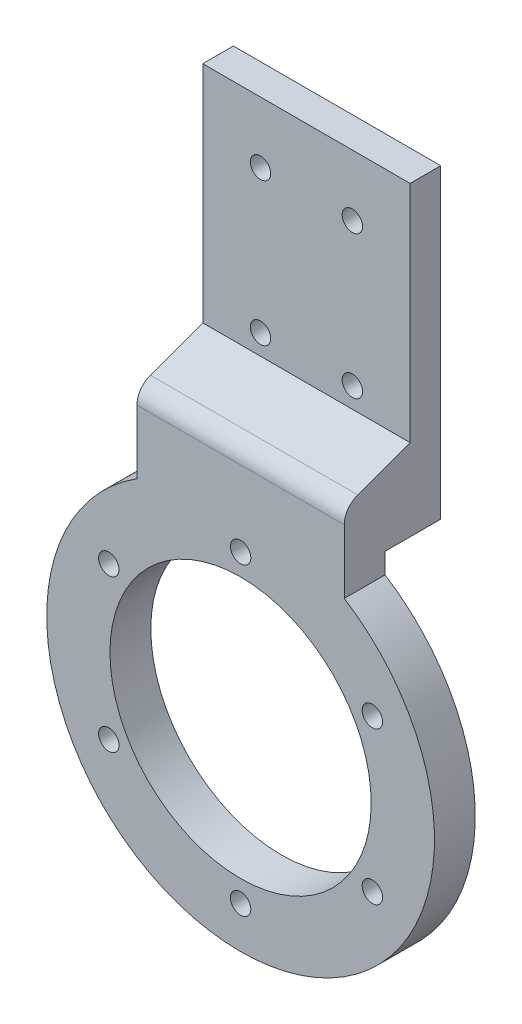
ISO-10303-21;
HEADER;
FILE_DESCRIPTION(('STEP AP214'),'2;1');
FILE_NAME('part.step','',(''),(''),'','','');
FILE_SCHEMA(('AUTOMOTIVE_DESIGN { 1 0 10303 214 1 1 1 1 }'));
ENDSEC;
DATA;
#1=APPLICATION_CONTEXT('core data for automotive mechanical design processes');
#2=APPLICATION_PROTOCOL_DEFINITION('international standard','automotive_design',2000,#1);
#3=PRODUCT_CONTEXT('',#1,'mechanical');
#4=PRODUCT('Part','Part','',(#3));
#5=PRODUCT_RELATED_PRODUCT_CATEGORY('part','',(#4));
#6=PRODUCT_DEFINITION_FORMATION('','',#4);
#7=PRODUCT_DEFINITION_CONTEXT('part definition',#1,'design');
#8=PRODUCT_DEFINITION('design','',#6,#7);
#9=PRODUCT_DEFINITION_SHAPE('','',#8);
#10=(LENGTH_UNIT() NAMED_UNIT(*) SI_UNIT(.MILLI.,.METRE.));
#11=(NAMED_UNIT(*) PLANE_ANGLE_UNIT() SI_UNIT($,.RADIAN.));
#12=(NAMED_UNIT(*) SI_UNIT($,.STERADIAN.) SOLID_ANGLE_UNIT());
#13=UNCERTAINTY_MEASURE_WITH_UNIT(LENGTH_MEASURE(1.E-05),#10,'distance_accuracy_value','');
#14=(GEOMETRIC_REPRESENTATION_CONTEXT(3) GLOBAL_UNCERTAINTY_ASSIGNED_CONTEXT((#13)) GLOBAL_UNIT_ASSIGNED_CONTEXT((#10,
#11,#12)) REPRESENTATION_CONTEXT('',''));
#15=CARTESIAN_POINT('',(0.,0.,0.));
#16=DIRECTION('',(0.,0.,1.));
#17=DIRECTION('',(1.,0.,0.));
#18=AXIS2_PLACEMENT_3D('',#15,#16,#17);
#19=CARTESIAN_POINT('',(-25.4,0.,7.5));
#20=DIRECTION('',(-1.,0.,0.));
#21=DIRECTION('',(0.,0.,1.));
#22=AXIS2_PLACEMENT_3D('',#19,#20,#21);
#23=PLANE('',#22);
#24=DIRECTION('',(0.,-1.,0.));
#25=VECTOR('',#24,1.);
#26=CARTESIAN_POINT('',(-25.4,0.,23.63));
#27=LINE('',#26,#25);
#28=CARTESIAN_POINT('',(-25.4,55.7665080479978,23.63));
#29=VERTEX_POINT('',#28);
#30=CARTESIAN_POINT('',(-25.4,40.13838561776,23.63));
#31=VERTEX_POINT('',#30);
#32=EDGE_CURVE('E247',#29,#31,#27,.T.);
#33=ORIENTED_EDGE('',*,*,#32,.F.);
#34=CARTESIAN_POINT('',(-25.4,55.7665080479978,18.63));
#35=DIRECTION('',(-1.,0.,0.));
#36=DIRECTION('',(0.,0.,1.));
#37=AXIS2_PLACEMENT_3D('',#34,#35,#36);
#38=CIRCLE('',#37,5.);
#39=CARTESIAN_POINT('',(-25.4,60.4649711519274,20.3401007166283));
#40=VERTEX_POINT('',#39);
#41=EDGE_CURVE('E201',#29,#40,#38,.T.);
#42=ORIENTED_EDGE('',*,*,#41,.T.);
#43=DIRECTION('',(0.,-0.342020143325666,0.939692620785909));
#44=VECTOR('',#43,1.);
#45=CARTESIAN_POINT('',(-25.4,65.1383856177602,7.5));
#46=LINE('',#45,#44);
#47=CARTESIAN_POINT('',(-25.4,65.1383856177602,7.5));
#48=VERTEX_POINT('',#47);
#49=EDGE_CURVE('E373',#40,#48,#46,.F.);
#50=ORIENTED_EDGE('',*,*,#49,.T.);
#51=DIRECTION('',(0.,1.,0.));
#52=VECTOR('',#51,1.);
#53=CARTESIAN_POINT('',(-25.4,0.,7.5));
#54=LINE('',#53,#52);
#55=CARTESIAN_POINT('',(-25.4,120.13838565576,7.5));
#56=VERTEX_POINT('',#55);
#57=EDGE_CURVE('E324',#48,#56,#54,.T.);
#58=ORIENTED_EDGE('',*,*,#57,.T.);
#59=DIRECTION('',(0.,0.,-1.));
#60=VECTOR('',#59,1.);
#61=CARTESIAN_POINT('',(-25.4,120.13838565576,7.5));
#62=LINE('',#61,#60);
#63=CARTESIAN_POINT('',(-25.4,120.13838565576,0.));
#64=VERTEX_POINT('',#63);
#65=EDGE_CURVE('E335',#56,#64,#62,.T.);
#66=ORIENTED_EDGE('',*,*,#65,.T.);
#67=DIRECTION('',(0.,1.,0.));
#68=VECTOR('',#67,1.);
#69=CARTESIAN_POINT('',(-25.4,0.,0.));
#70=LINE('',#69,#68);
#71=CARTESIAN_POINT('',(-25.4,45.13838561776,0.));
#72=VERTEX_POINT('',#71);
#73=EDGE_CURVE('E351',#72,#64,#70,.T.);
#74=ORIENTED_EDGE('',*,*,#73,.F.);
#75=DIRECTION('',(0.,0.,-1.));
#76=VECTOR('',#75,1.);
#77=CARTESIAN_POINT('',(-25.4,45.13838561776,13.63));
#78=LINE('',#77,#76);
#79=CARTESIAN_POINT('',(-25.4,45.13838561776,13.63));
#80=VERTEX_POINT('',#79);
#81=EDGE_CURVE('E302',#80,#72,#78,.T.);
#82=ORIENTED_EDGE('',*,*,#81,.F.);
#83=DIRECTION('',(0.,-1.,0.));
#84=VECTOR('',#83,1.);
#85=CARTESIAN_POINT('',(-25.4,0.,13.63));
#86=LINE('',#85,#84);
#87=CARTESIAN_POINT('',(-25.4,40.13838561776,13.63));
#88=VERTEX_POINT('',#87);
#89=EDGE_CURVE('E263',#80,#88,#86,.T.);
#90=ORIENTED_EDGE('',*,*,#89,.T.);
#91=DIRECTION('',(0.,0.,-1.));
#92=VECTOR('',#91,1.);
#93=CARTESIAN_POINT('',(-25.4,40.13838561776,23.63));
#94=LINE('',#93,#92);
#95=EDGE_CURVE('E261',#31,#88,#94,.T.);
#96=ORIENTED_EDGE('',*,*,#95,.F.);
#97=EDGE_LOOP('',(#33,#42,#50,#58,#66,#74,#82,#90,#96));
#98=FACE_BOUND('',#97,.T.);
#99=ADVANCED_FACE('F178',(#98),#23,.T.);
#100=CARTESIAN_POINT('',(25.4,0.,7.5));
#101=DIRECTION('',(1.,0.,0.));
#102=DIRECTION('',(0.,0.,-1.));
#103=AXIS2_PLACEMENT_3D('',#100,#101,#102);
#104=PLANE('',#103);
#105=DIRECTION('',(0.,0.342020143325666,-0.939692620785909));
#106=VECTOR('',#105,1.);
#107=CARTESIAN_POINT('',(25.4,65.1383856177602,7.5));
#108=LINE('',#107,#106);
#109=CARTESIAN_POINT('',(25.4,65.1383856177602,7.5));
#110=VERTEX_POINT('',#109);
#111=CARTESIAN_POINT('',(25.4,60.4649711519274,20.3401007166283));
#112=VERTEX_POINT('',#111);
#113=EDGE_CURVE('E370',#110,#112,#108,.F.);
#114=ORIENTED_EDGE('',*,*,#113,.T.);
#115=CARTESIAN_POINT('',(25.4,55.7665080479978,18.63));
#116=DIRECTION('',(1.,0.,0.));
#117=DIRECTION('',(0.,0.,-1.));
#118=AXIS2_PLACEMENT_3D('',#115,#116,#117);
#119=CIRCLE('',#118,5.);
#120=CARTESIAN_POINT('',(25.4,55.7665080479978,23.63));
#121=VERTEX_POINT('',#120);
#122=EDGE_CURVE('E12',#112,#121,#119,.T.);
#123=ORIENTED_EDGE('',*,*,#122,.T.);
#124=DIRECTION('',(0.,1.,0.));
#125=VECTOR('',#124,1.);
#126=CARTESIAN_POINT('',(25.4,0.,23.63));
#127=LINE('',#126,#125);
#128=CARTESIAN_POINT('',(25.4,40.13838561776,23.63));
#129=VERTEX_POINT('',#128);
#130=EDGE_CURVE('E274',#129,#121,#127,.T.);
#131=ORIENTED_EDGE('',*,*,#130,.F.);
#132=DIRECTION('',(0.,0.,-1.));
#133=VECTOR('',#132,1.);
#134=CARTESIAN_POINT('',(25.4,40.13838561776,23.63));
#135=LINE('',#134,#133);
#136=CARTESIAN_POINT('',(25.4,40.13838561776,13.63));
#137=VERTEX_POINT('',#136);
#138=EDGE_CURVE('E268',#129,#137,#135,.T.);
#139=ORIENTED_EDGE('',*,*,#138,.T.);
#140=DIRECTION('',(0.,1.,0.));
#141=VECTOR('',#140,1.);
#142=CARTESIAN_POINT('',(25.4,0.,13.63));
#143=LINE('',#142,#141);
#144=CARTESIAN_POINT('',(25.4,45.13838561776,13.63));
#145=VERTEX_POINT('',#144);
#146=EDGE_CURVE('E258',#137,#145,#143,.T.);
#147=ORIENTED_EDGE('',*,*,#146,.T.);
#148=DIRECTION('',(0.,0.,-1.));
#149=VECTOR('',#148,1.);
#150=CARTESIAN_POINT('',(25.4,45.13838561776,13.63));
#151=LINE('',#150,#149);
#152=CARTESIAN_POINT('',(25.4,45.13838561776,0.));
#153=VERTEX_POINT('',#152);
#154=EDGE_CURVE('E295',#145,#153,#151,.T.);
#155=ORIENTED_EDGE('',*,*,#154,.T.);
#156=DIRECTION('',(0.,-1.,0.));
#157=VECTOR('',#156,1.);
#158=CARTESIAN_POINT('',(25.4,0.,0.));
#159=LINE('',#158,#157);
#160=CARTESIAN_POINT('',(25.4,120.13838565576,0.));
#161=VERTEX_POINT('',#160);
#162=EDGE_CURVE('E355',#161,#153,#159,.T.);
#163=ORIENTED_EDGE('',*,*,#162,.F.);
#164=DIRECTION('',(0.,0.,-1.));
#165=VECTOR('',#164,1.);
#166=CARTESIAN_POINT('',(25.4,120.13838565576,7.5));
#167=LINE('',#166,#165);
#168=CARTESIAN_POINT('',(25.4,120.13838565576,7.5));
#169=VERTEX_POINT('',#168);
#170=EDGE_CURVE('E363',#169,#161,#167,.T.);
#171=ORIENTED_EDGE('',*,*,#170,.F.);
#172=DIRECTION('',(0.,-1.,0.));
#173=VECTOR('',#172,1.);
#174=CARTESIAN_POINT('',(25.4,0.,7.5));
#175=LINE('',#174,#173);
#176=EDGE_CURVE('E327',#169,#110,#175,.T.);
#177=ORIENTED_EDGE('',*,*,#176,.T.);
#178=EDGE_LOOP('',(#114,#123,#131,#139,#147,#155,#163,#171,#177));
#179=FACE_BOUND('',#178,.T.);
#180=ADVANCED_FACE('F390',(#179),#104,.T.);
#181=CARTESIAN_POINT('',(-11.25,105.13838565576,7.5));
#182=DIRECTION('',(0.,0.,-1.));
#183=DIRECTION('',(-1.,0.,0.));
#184=AXIS2_PLACEMENT_3D('',#181,#182,#183);
#185=CYLINDRICAL_SURFACE('',#184,2.5);
#186=CARTESIAN_POINT('',(-11.25,105.13838565576,7.5));
#187=DIRECTION('',(0.,0.,1.));
#188=DIRECTION('',(1.,0.,0.));
#189=AXIS2_PLACEMENT_3D('',#186,#187,#188);
#190=CIRCLE('',#189,2.5);
#191=CARTESIAN_POINT('',(-8.75,105.13838565576,7.5));
#192=VERTEX_POINT('',#191);
#193=EDGE_CURVE('E320',#192,#192,#190,.T.);
#194=ORIENTED_EDGE('',*,*,#193,.T.);
#195=EDGE_LOOP('',(#194));
#196=FACE_BOUND('',#195,.T.);
#197=CARTESIAN_POINT('',(-11.25,105.13838565576,0.));
#198=DIRECTION('',(0.,0.,1.));
#199=DIRECTION('',(1.,0.,0.));
#200=AXIS2_PLACEMENT_3D('',#197,#198,#199);
#201=CIRCLE('',#200,2.5);
#202=CARTESIAN_POINT('',(-8.75,105.13838565576,0.));
#203=VERTEX_POINT('',#202);
#204=EDGE_CURVE('E347',#203,#203,#201,.T.);
#205=ORIENTED_EDGE('',*,*,#204,.F.);
#206=EDGE_LOOP('',(#205));
#207=FACE_BOUND('',#206,.T.);
#208=ADVANCED_FACE('F403',(#196,#207),#185,.F.);
#209=CARTESIAN_POINT('',(11.25,105.13838565576,7.5));
#210=DIRECTION('',(0.,0.,-1.));
#211=DIRECTION('',(-1.,0.,0.));
#212=AXIS2_PLACEMENT_3D('',#209,#210,#211);
#213=CYLINDRICAL_SURFACE('',#212,2.50000000000001);
#214=CARTESIAN_POINT('',(11.25,105.13838565576,7.5));
#215=DIRECTION('',(0.,0.,1.));
#216=DIRECTION('',(1.,0.,0.));
#217=AXIS2_PLACEMENT_3D('',#214,#215,#216);
#218=CIRCLE('',#217,2.50000000000001);
#219=CARTESIAN_POINT('',(13.75,105.13838565576,7.5));
#220=VERTEX_POINT('',#219);
#221=EDGE_CURVE('E316',#220,#220,#218,.T.);
#222=ORIENTED_EDGE('',*,*,#221,.T.);
#223=EDGE_LOOP('',(#222));
#224=FACE_BOUND('',#223,.T.);
#225=CARTESIAN_POINT('',(11.25,105.13838565576,0.));
#226=DIRECTION('',(0.,0.,1.));
#227=DIRECTION('',(1.,0.,0.));
#228=AXIS2_PLACEMENT_3D('',#225,#226,#227);
#229=CIRCLE('',#228,2.50000000000001);
#230=CARTESIAN_POINT('',(13.75,105.13838565576,0.));
#231=VERTEX_POINT('',#230);
#232=EDGE_CURVE('E343',#231,#231,#229,.T.);
#233=ORIENTED_EDGE('',*,*,#232,.F.);
#234=EDGE_LOOP('',(#233));
#235=FACE_BOUND('',#234,.T.);
#236=ADVANCED_FACE('F409',(#224,#235),#213,.F.);
#237=CARTESIAN_POINT('',(11.25,70.13838565576,7.5));
#238=DIRECTION('',(0.,0.,-1.));
#239=DIRECTION('',(-1.,0.,0.));
#240=AXIS2_PLACEMENT_3D('',#237,#238,#239);
#241=CYLINDRICAL_SURFACE('',#240,2.5);
#242=CARTESIAN_POINT('',(11.25,70.13838565576,7.5));
#243=DIRECTION('',(0.,0.,1.));
#244=DIRECTION('',(1.,0.,0.));
#245=AXIS2_PLACEMENT_3D('',#242,#243,#244);
#246=CIRCLE('',#245,2.5);
#247=CARTESIAN_POINT('',(13.75,70.13838565576,7.5));
#248=VERTEX_POINT('',#247);
#249=EDGE_CURVE('E311',#248,#248,#246,.T.);
#250=ORIENTED_EDGE('',*,*,#249,.T.);
#251=EDGE_LOOP('',(#250));
#252=FACE_BOUND('',#251,.T.);
#253=CARTESIAN_POINT('',(11.25,70.13838565576,0.));
#254=DIRECTION('',(0.,0.,1.));
#255=DIRECTION('',(1.,0.,0.));
#256=AXIS2_PLACEMENT_3D('',#253,#254,#255);
#257=CIRCLE('',#256,2.5);
#258=CARTESIAN_POINT('',(13.75,70.13838565576,0.));
#259=VERTEX_POINT('',#258);
#260=EDGE_CURVE('E339',#259,#259,#257,.T.);
#261=ORIENTED_EDGE('',*,*,#260,.F.);
#262=EDGE_LOOP('',(#261));
#263=FACE_BOUND('',#262,.T.);
#264=ADVANCED_FACE('F413',(#252,#263),#241,.F.);
#265=CARTESIAN_POINT('',(-11.25,70.13838565576,7.5));
#266=DIRECTION('',(0.,0.,-1.));
#267=DIRECTION('',(-1.,0.,0.));
#268=AXIS2_PLACEMENT_3D('',#265,#266,#267);
#269=CYLINDRICAL_SURFACE('',#268,2.50000000000001);
#270=CARTESIAN_POINT('',(-11.25,70.13838565576,7.5));
#271=DIRECTION('',(0.,0.,1.));
#272=DIRECTION('',(1.,0.,0.));
#273=AXIS2_PLACEMENT_3D('',#270,#271,#272);
#274=CIRCLE('',#273,2.50000000000001);
#275=CARTESIAN_POINT('',(-8.75,70.13838565576,7.5));
#276=VERTEX_POINT('',#275);
#277=EDGE_CURVE('E307',#276,#276,#274,.T.);
#278=ORIENTED_EDGE('',*,*,#277,.T.);
#279=EDGE_LOOP('',(#278));
#280=FACE_BOUND('',#279,.T.);
#281=CARTESIAN_POINT('',(-11.25,70.13838565576,0.));
#282=DIRECTION('',(0.,0.,1.));
#283=DIRECTION('',(1.,0.,0.));
#284=AXIS2_PLACEMENT_3D('',#281,#282,#283);
#285=CIRCLE('',#284,2.50000000000001);
#286=CARTESIAN_POINT('',(-8.75,70.13838565576,0.));
#287=VERTEX_POINT('',#286);
#288=EDGE_CURVE('E306',#287,#287,#285,.T.);
#289=ORIENTED_EDGE('',*,*,#288,.F.);
#290=EDGE_LOOP('',(#289));
#291=FACE_BOUND('',#290,.T.);
#292=ADVANCED_FACE('F417',(#280,#291),#269,.F.);
#293=CARTESIAN_POINT('',(0.,120.13838565576,7.5));
#294=DIRECTION('',(0.,1.,0.));
#295=DIRECTION('',(0.,0.,1.));
#296=AXIS2_PLACEMENT_3D('',#293,#294,#295);
#297=PLANE('',#296);
#298=DIRECTION('',(1.,0.,0.));
#299=VECTOR('',#298,1.);
#300=CARTESIAN_POINT('',(0.,120.13838565576,0.));
#301=LINE('',#300,#299);
#302=EDGE_CURVE('E312',#64,#161,#301,.T.);
#303=ORIENTED_EDGE('',*,*,#302,.F.);
#304=ORIENTED_EDGE('',*,*,#65,.F.);
#305=DIRECTION('',(1.,0.,0.));
#306=VECTOR('',#305,1.);
#307=CARTESIAN_POINT('',(0.,120.13838565576,7.5));
#308=LINE('',#307,#306);
#309=EDGE_CURVE('E331',#56,#169,#308,.T.);
#310=ORIENTED_EDGE('',*,*,#309,.T.);
#311=ORIENTED_EDGE('',*,*,#170,.T.);
#312=EDGE_LOOP('',(#303,#304,#310,#311));
#313=FACE_BOUND('',#312,.T.);
#314=ADVANCED_FACE('F420',(#313),#297,.T.);
#315=CARTESIAN_POINT('',(0.,0.,7.5));
#316=DIRECTION('',(0.,0.,1.));
#317=DIRECTION('',(1.,0.,0.));
#318=AXIS2_PLACEMENT_3D('',#315,#316,#317);
#319=PLANE('',#318);
#320=ORIENTED_EDGE('',*,*,#277,.F.);
#321=EDGE_LOOP('',(#320));
#322=FACE_BOUND('',#321,.T.);
#323=ORIENTED_EDGE('',*,*,#249,.F.);
#324=EDGE_LOOP('',(#323));
#325=FACE_BOUND('',#324,.T.);
#326=ORIENTED_EDGE('',*,*,#221,.F.);
#327=EDGE_LOOP('',(#326));
#328=FACE_BOUND('',#327,.T.);
#329=ORIENTED_EDGE('',*,*,#193,.F.);
#330=EDGE_LOOP('',(#329));
#331=FACE_BOUND('',#330,.T.);
#332=ORIENTED_EDGE('',*,*,#57,.F.);
#333=DIRECTION('',(1.,0.,0.));
#334=VECTOR('',#333,1.);
#335=CARTESIAN_POINT('',(25.4,65.1383856177602,7.5));
#336=LINE('',#335,#334);
#337=EDGE_CURVE('E366',#48,#110,#336,.T.);
#338=ORIENTED_EDGE('',*,*,#337,.T.);
#339=ORIENTED_EDGE('',*,*,#176,.F.);
#340=ORIENTED_EDGE('',*,*,#309,.F.);
#341=EDGE_LOOP('',(#332,#338,#339,#340));
#342=FACE_BOUND('',#341,.T.);
#343=ADVANCED_FACE('F385',(#322,#325,#328,#331,#342),#319,.T.);
#344=CARTESIAN_POINT('',(0.,0.,0.));
#345=DIRECTION('',(0.,0.,1.));
#346=DIRECTION('',(1.,0.,0.));
#347=AXIS2_PLACEMENT_3D('',#344,#345,#346);
#348=PLANE('',#347);
#349=ORIENTED_EDGE('',*,*,#288,.T.);
#350=EDGE_LOOP('',(#349));
#351=FACE_BOUND('',#350,.T.);
#352=ORIENTED_EDGE('',*,*,#260,.T.);
#353=EDGE_LOOP('',(#352));
#354=FACE_BOUND('',#353,.T.);
#355=ORIENTED_EDGE('',*,*,#232,.T.);
#356=EDGE_LOOP('',(#355));
#357=FACE_BOUND('',#356,.T.);
#358=ORIENTED_EDGE('',*,*,#204,.T.);
#359=EDGE_LOOP('',(#358));
#360=FACE_BOUND('',#359,.T.);
#361=ORIENTED_EDGE('',*,*,#73,.T.);
#362=ORIENTED_EDGE('',*,*,#302,.T.);
#363=ORIENTED_EDGE('',*,*,#162,.T.);
#364=DIRECTION('',(1.,0.,0.));
#365=VECTOR('',#364,1.);
#366=CARTESIAN_POINT('',(0.,45.13838561776,0.));
#367=LINE('',#366,#365);
#368=EDGE_CURVE('E267',#72,#153,#367,.T.);
#369=ORIENTED_EDGE('',*,*,#368,.F.);
#370=EDGE_LOOP('',(#361,#362,#363,#369));
#371=FACE_BOUND('',#370,.T.);
#372=ADVANCED_FACE('F433',(#351,#354,#357,#360,#371),#348,.F.);
#373=CARTESIAN_POINT('',(0.,45.13838561776,13.63));
#374=DIRECTION('',(0.,1.,0.));
#375=DIRECTION('',(0.,0.,1.));
#376=AXIS2_PLACEMENT_3D('',#373,#374,#375);
#377=PLANE('',#376);
#378=ORIENTED_EDGE('',*,*,#368,.T.);
#379=ORIENTED_EDGE('',*,*,#154,.F.);
#380=DIRECTION('',(1.,0.,0.));
#381=VECTOR('',#380,1.);
#382=CARTESIAN_POINT('',(0.,45.13838561776,13.63));
#383=LINE('',#382,#381);
#384=EDGE_CURVE('E291',#80,#145,#383,.T.);
#385=ORIENTED_EDGE('',*,*,#384,.F.);
#386=ORIENTED_EDGE('',*,*,#81,.T.);
#387=EDGE_LOOP('',(#378,#379,#385,#386));
#388=FACE_BOUND('',#387,.T.);
#389=ADVANCED_FACE('F436',(#388),#377,.F.);
#390=CARTESIAN_POINT('',(0.,0.,13.63));
#391=DIRECTION('',(0.,0.,1.));
#392=DIRECTION('',(1.,0.,0.));
#393=AXIS2_PLACEMENT_3D('',#390,#391,#392);
#394=PLANE('',#393);
#395=CARTESIAN_POINT('',(0.,0.,13.63));
#396=DIRECTION('',(0.,0.,1.));
#397=DIRECTION('',(1.,0.,0.));
#398=AXIS2_PLACEMENT_3D('',#395,#396,#397);
#399=CIRCLE('',#398,32.);
#400=CARTESIAN_POINT('',(32.,0.,13.63));
#401=VERTEX_POINT('',#400);
#402=EDGE_CURVE('E653',#401,#401,#399,.T.);
#403=ORIENTED_EDGE('',*,*,#402,.T.);
#404=EDGE_LOOP('',(#403));
#405=FACE_BOUND('',#404,.T.);
#406=CARTESIAN_POINT('',(0.,37.28,13.63));
#407=DIRECTION('',(0.,0.,1.));
#408=DIRECTION('',(1.,0.,0.));
#409=AXIS2_PLACEMENT_3D('',#406,#407,#408);
#410=CIRCLE('',#409,2.5);
#411=CARTESIAN_POINT('',(2.5,37.28,13.63));
#412=VERTEX_POINT('',#411);
#413=EDGE_CURVE('E660',#412,#412,#410,.T.);
#414=ORIENTED_EDGE('',*,*,#413,.T.);
#415=EDGE_LOOP('',(#414));
#416=FACE_BOUND('',#415,.T.);
#417=CARTESIAN_POINT('',(32.2854270530839,18.64,13.63));
#418=DIRECTION('',(0.,0.,1.));
#419=DIRECTION('',(1.,0.,0.));
#420=AXIS2_PLACEMENT_3D('',#417,#418,#419);
#421=CIRCLE('',#420,2.49999999999999);
#422=CARTESIAN_POINT('',(34.7854270530839,18.64,13.63));
#423=VERTEX_POINT('',#422);
#424=EDGE_CURVE('E667',#423,#423,#421,.T.);
#425=ORIENTED_EDGE('',*,*,#424,.T.);
#426=EDGE_LOOP('',(#425));
#427=FACE_BOUND('',#426,.T.);
#428=CARTESIAN_POINT('',(32.2854270530839,-18.64,13.63));
#429=DIRECTION('',(0.,0.,1.));
#430=DIRECTION('',(1.,0.,0.));
#431=AXIS2_PLACEMENT_3D('',#428,#429,#430);
#432=CIRCLE('',#431,2.49999999999999);
#433=CARTESIAN_POINT('',(34.7854270530839,-18.64,13.63));
#434=VERTEX_POINT('',#433);
#435=EDGE_CURVE('E675',#434,#434,#432,.T.);
#436=ORIENTED_EDGE('',*,*,#435,.T.);
#437=EDGE_LOOP('',(#436));
#438=FACE_BOUND('',#437,.T.);
#439=CARTESIAN_POINT('',(0.,-37.28,13.63));
#440=DIRECTION('',(0.,0.,1.));
#441=DIRECTION('',(1.,0.,0.));
#442=AXIS2_PLACEMENT_3D('',#439,#440,#441);
#443=CIRCLE('',#442,2.5);
#444=CARTESIAN_POINT('',(2.5,-37.28,13.63));
#445=VERTEX_POINT('',#444);
#446=EDGE_CURVE('E683',#445,#445,#443,.T.);
#447=ORIENTED_EDGE('',*,*,#446,.T.);
#448=EDGE_LOOP('',(#447));
#449=FACE_BOUND('',#448,.T.);
#450=CARTESIAN_POINT('',(-32.2854270530839,-18.64,13.63));
#451=DIRECTION('',(0.,0.,1.));
#452=DIRECTION('',(1.,0.,0.));
#453=AXIS2_PLACEMENT_3D('',#450,#451,#452);
#454=CIRCLE('',#453,2.5);
#455=CARTESIAN_POINT('',(-29.7854270530839,-18.64,13.63));
#456=VERTEX_POINT('',#455);
#457=EDGE_CURVE('E691',#456,#456,#454,.T.);
#458=ORIENTED_EDGE('',*,*,#457,.T.);
#459=EDGE_LOOP('',(#458));
#460=FACE_BOUND('',#459,.T.);
#461=CARTESIAN_POINT('',(-32.2854270530839,18.64,13.63));
#462=DIRECTION('',(0.,0.,1.));
#463=DIRECTION('',(1.,0.,0.));
#464=AXIS2_PLACEMENT_3D('',#461,#462,#463);
#465=CIRCLE('',#464,2.5);
#466=CARTESIAN_POINT('',(-29.7854270530839,18.64,13.63));
#467=VERTEX_POINT('',#466);
#468=EDGE_CURVE('E699',#467,#467,#465,.T.);
#469=ORIENTED_EDGE('',*,*,#468,.T.);
#470=EDGE_LOOP('',(#469));
#471=FACE_BOUND('',#470,.T.);
#472=ORIENTED_EDGE('',*,*,#89,.F.);
#473=ORIENTED_EDGE('',*,*,#384,.T.);
#474=ORIENTED_EDGE('',*,*,#146,.F.);
#475=CARTESIAN_POINT('',(0.,0.,13.63));
#476=DIRECTION('',(0.,0.,1.));
#477=DIRECTION('',(1.,0.,0.));
#478=AXIS2_PLACEMENT_3D('',#475,#476,#477);
#479=CIRCLE('',#478,47.5);
#480=EDGE_CURVE('E282',#88,#137,#479,.T.);
#481=ORIENTED_EDGE('',*,*,#480,.F.);
#482=EDGE_LOOP('',(#472,#473,#474,#481));
#483=FACE_BOUND('',#482,.T.);
#484=ADVANCED_FACE('F451',(#405,#416,#427,#438,#449,#460,#471,#483),#394,.F.);
#485=CARTESIAN_POINT('',(0.,0.,23.63));
#486=DIRECTION('',(0.,0.,1.));
#487=DIRECTION('',(1.,0.,0.));
#488=AXIS2_PLACEMENT_3D('',#485,#486,#487);
#489=PLANE('',#488);
#490=CARTESIAN_POINT('',(-32.2854270530839,-18.64,23.63));
#491=DIRECTION('',(0.,0.,1.));
#492=DIRECTION('',(1.,0.,0.));
#493=AXIS2_PLACEMENT_3D('',#490,#491,#492);
#494=CIRCLE('',#493,2.5);
#495=CARTESIAN_POINT('',(-29.7854270530839,-18.64,23.63));
#496=VERTEX_POINT('',#495);
#497=EDGE_CURVE('E687',#496,#496,#494,.T.);
#498=ORIENTED_EDGE('',*,*,#497,.F.);
#499=EDGE_LOOP('',(#498));
#500=FACE_BOUND('',#499,.T.);
#501=CARTESIAN_POINT('',(32.2854270530839,-18.64,23.63));
#502=DIRECTION('',(0.,0.,1.));
#503=DIRECTION('',(1.,0.,0.));
#504=AXIS2_PLACEMENT_3D('',#501,#502,#503);
#505=CIRCLE('',#504,2.49999999999999);
#506=CARTESIAN_POINT('',(34.7854270530839,-18.64,23.63));
#507=VERTEX_POINT('',#506);
#508=EDGE_CURVE('E671',#507,#507,#505,.T.);
#509=ORIENTED_EDGE('',*,*,#508,.F.);
#510=EDGE_LOOP('',(#509));
#511=FACE_BOUND('',#510,.T.);
#512=CARTESIAN_POINT('',(0.,37.28,23.63));
#513=DIRECTION('',(0.,0.,1.));
#514=DIRECTION('',(1.,0.,0.));
#515=AXIS2_PLACEMENT_3D('',#512,#513,#514);
#516=CIRCLE('',#515,2.5);
#517=CARTESIAN_POINT('',(2.5,37.28,23.63));
#518=VERTEX_POINT('',#517);
#519=EDGE_CURVE('E655',#518,#518,#516,.T.);
#520=ORIENTED_EDGE('',*,*,#519,.F.);
#521=EDGE_LOOP('',(#520));
#522=FACE_BOUND('',#521,.T.);
#523=ORIENTED_EDGE('',*,*,#130,.T.);
#524=DIRECTION('',(1.,0.,0.));
#525=VECTOR('',#524,1.);
#526=CARTESIAN_POINT('',(-25.4,55.7665080479978,23.63));
#527=LINE('',#526,#525);
#528=EDGE_CURVE('E256',#121,#29,#527,.F.);
#529=ORIENTED_EDGE('',*,*,#528,.T.);
#530=ORIENTED_EDGE('',*,*,#32,.T.);
#531=CARTESIAN_POINT('',(0.,0.,23.63));
#532=DIRECTION('',(0.,0.,1.));
#533=DIRECTION('',(1.,0.,0.));
#534=AXIS2_PLACEMENT_3D('',#531,#532,#533);
#535=CIRCLE('',#534,47.5);
#536=EDGE_CURVE('E253',#31,#129,#535,.T.);
#537=ORIENTED_EDGE('',*,*,#536,.T.);
#538=EDGE_LOOP('',(#523,#529,#530,#537));
#539=FACE_BOUND('',#538,.T.);
#540=CARTESIAN_POINT('',(0.,0.,23.63));
#541=DIRECTION('',(0.,0.,1.));
#542=DIRECTION('',(1.,0.,0.));
#543=AXIS2_PLACEMENT_3D('',#540,#541,#542);
#544=CIRCLE('',#543,32.);
#545=CARTESIAN_POINT('',(32.,0.,23.63));
#546=VERTEX_POINT('',#545);
#547=EDGE_CURVE('E283',#546,#546,#544,.T.);
#548=ORIENTED_EDGE('',*,*,#547,.F.);
#549=EDGE_LOOP('',(#548));
#550=FACE_BOUND('',#549,.T.);
#551=CARTESIAN_POINT('',(32.2854270530839,18.64,23.63));
#552=DIRECTION('',(0.,0.,1.));
#553=DIRECTION('',(1.,0.,0.));
#554=AXIS2_PLACEMENT_3D('',#551,#552,#553);
#555=CIRCLE('',#554,2.49999999999999);
#556=CARTESIAN_POINT('',(34.7854270530839,18.64,23.63));
#557=VERTEX_POINT('',#556);
#558=EDGE_CURVE('E665',#557,#557,#555,.T.);
#559=ORIENTED_EDGE('',*,*,#558,.F.);
#560=EDGE_LOOP('',(#559));
#561=FACE_BOUND('',#560,.T.);
#562=CARTESIAN_POINT('',(0.,-37.28,23.63));
#563=DIRECTION('',(0.,0.,1.));
#564=DIRECTION('',(1.,0.,0.));
#565=AXIS2_PLACEMENT_3D('',#562,#563,#564);
#566=CIRCLE('',#565,2.5);
#567=CARTESIAN_POINT('',(2.5,-37.28,23.63));
#568=VERTEX_POINT('',#567);
#569=EDGE_CURVE('E679',#568,#568,#566,.T.);
#570=ORIENTED_EDGE('',*,*,#569,.F.);
#571=EDGE_LOOP('',(#570));
#572=FACE_BOUND('',#571,.T.);
#573=CARTESIAN_POINT('',(-32.2854270530839,18.64,23.63));
#574=DIRECTION('',(0.,0.,1.));
#575=DIRECTION('',(1.,0.,0.));
#576=AXIS2_PLACEMENT_3D('',#573,#574,#575);
#577=CIRCLE('',#576,2.5);
#578=CARTESIAN_POINT('',(-29.7854270530839,18.64,23.63));
#579=VERTEX_POINT('',#578);
#580=EDGE_CURVE('E695',#579,#579,#577,.T.);
#581=ORIENTED_EDGE('',*,*,#580,.F.);
#582=EDGE_LOOP('',(#581));
#583=FACE_BOUND('',#582,.T.);
#584=ADVANCED_FACE('F250',(#500,#511,#522,#539,#550,#561,#572,#583),#489,.T.);
#585=CARTESIAN_POINT('',(0.,0.,23.63));
#586=DIRECTION('',(0.,0.,-1.));
#587=DIRECTION('',(-1.,0.,0.));
#588=AXIS2_PLACEMENT_3D('',#585,#586,#587);
#589=CYLINDRICAL_SURFACE('',#588,47.5);
#590=ORIENTED_EDGE('',*,*,#480,.T.);
#591=ORIENTED_EDGE('',*,*,#138,.F.);
#592=ORIENTED_EDGE('',*,*,#536,.F.);
#593=ORIENTED_EDGE('',*,*,#95,.T.);
#594=EDGE_LOOP('',(#590,#591,#592,#593));
#595=FACE_BOUND('',#594,.T.);
#596=ADVANCED_FACE('F270',(#595),#589,.T.);
#597=CARTESIAN_POINT('',(0.,0.,23.63));
#598=DIRECTION('',(0.,0.,-1.));
#599=DIRECTION('',(-1.,0.,0.));
#600=AXIS2_PLACEMENT_3D('',#597,#598,#599);
#601=CYLINDRICAL_SURFACE('',#600,32.);
#602=ORIENTED_EDGE('',*,*,#547,.T.);
#603=EDGE_LOOP('',(#602));
#604=FACE_BOUND('',#603,.T.);
#605=ORIENTED_EDGE('',*,*,#402,.F.);
#606=EDGE_LOOP('',(#605));
#607=FACE_BOUND('',#606,.T.);
#608=ADVANCED_FACE('F467',(#604,#607),#601,.F.);
#609=CARTESIAN_POINT('',(0.,37.28,23.63));
#610=DIRECTION('',(0.,0.,-1.));
#611=DIRECTION('',(-1.,0.,0.));
#612=AXIS2_PLACEMENT_3D('',#609,#610,#611);
#613=CYLINDRICAL_SURFACE('',#612,2.5);
#614=ORIENTED_EDGE('',*,*,#519,.T.);
#615=EDGE_LOOP('',(#614));
#616=FACE_BOUND('',#615,.T.);
#617=ORIENTED_EDGE('',*,*,#413,.F.);
#618=EDGE_LOOP('',(#617));
#619=FACE_BOUND('',#618,.T.);
#620=ADVANCED_FACE('F527',(#616,#619),#613,.F.);
#621=CARTESIAN_POINT('',(32.2854270530839,18.64,23.63));
#622=DIRECTION('',(0.,0.,-1.));
#623=DIRECTION('',(-1.,0.,0.));
#624=AXIS2_PLACEMENT_3D('',#621,#622,#623);
#625=CYLINDRICAL_SURFACE('',#624,2.49999999999999);
#626=ORIENTED_EDGE('',*,*,#558,.T.);
#627=EDGE_LOOP('',(#626));
#628=FACE_BOUND('',#627,.T.);
#629=ORIENTED_EDGE('',*,*,#424,.F.);
#630=EDGE_LOOP('',(#629));
#631=FACE_BOUND('',#630,.T.);
#632=ADVANCED_FACE('F518',(#628,#631),#625,.F.);
#633=CARTESIAN_POINT('',(32.2854270530839,-18.64,23.63));
#634=DIRECTION('',(0.,0.,-1.));
#635=DIRECTION('',(-1.,0.,0.));
#636=AXIS2_PLACEMENT_3D('',#633,#634,#635);
#637=CYLINDRICAL_SURFACE('',#636,2.49999999999999);
#638=ORIENTED_EDGE('',*,*,#508,.T.);
#639=EDGE_LOOP('',(#638));
#640=FACE_BOUND('',#639,.T.);
#641=ORIENTED_EDGE('',*,*,#435,.F.);
#642=EDGE_LOOP('',(#641));
#643=FACE_BOUND('',#642,.T.);
#644=ADVANCED_FACE('F509',(#640,#643),#637,.F.);
#645=CARTESIAN_POINT('',(0.,-37.28,23.63));
#646=DIRECTION('',(0.,0.,-1.));
#647=DIRECTION('',(-1.,0.,0.));
#648=AXIS2_PLACEMENT_3D('',#645,#646,#647);
#649=CYLINDRICAL_SURFACE('',#648,2.5);
#650=ORIENTED_EDGE('',*,*,#569,.T.);
#651=EDGE_LOOP('',(#650));
#652=FACE_BOUND('',#651,.T.);
#653=ORIENTED_EDGE('',*,*,#446,.F.);
#654=EDGE_LOOP('',(#653));
#655=FACE_BOUND('',#654,.T.);
#656=ADVANCED_FACE('F500',(#652,#655),#649,.F.);
#657=CARTESIAN_POINT('',(-32.2854270530839,-18.64,23.63));
#658=DIRECTION('',(0.,0.,-1.));
#659=DIRECTION('',(-1.,0.,0.));
#660=AXIS2_PLACEMENT_3D('',#657,#658,#659);
#661=CYLINDRICAL_SURFACE('',#660,2.5);
#662=ORIENTED_EDGE('',*,*,#497,.T.);
#663=EDGE_LOOP('',(#662));
#664=FACE_BOUND('',#663,.T.);
#665=ORIENTED_EDGE('',*,*,#457,.F.);
#666=EDGE_LOOP('',(#665));
#667=FACE_BOUND('',#666,.T.);
#668=ADVANCED_FACE('F490',(#664,#667),#661,.F.);
#669=CARTESIAN_POINT('',(-32.2854270530839,18.64,23.63));
#670=DIRECTION('',(0.,0.,-1.));
#671=DIRECTION('',(-1.,0.,0.));
#672=AXIS2_PLACEMENT_3D('',#669,#670,#671);
#673=CYLINDRICAL_SURFACE('',#672,2.5);
#674=ORIENTED_EDGE('',*,*,#580,.T.);
#675=EDGE_LOOP('',(#674));
#676=FACE_BOUND('',#675,.T.);
#677=ORIENTED_EDGE('',*,*,#468,.F.);
#678=EDGE_LOOP('',(#677));
#679=FACE_BOUND('',#678,.T.);
#680=ADVANCED_FACE('F396',(#676,#679),#673,.F.);
#681=CARTESIAN_POINT('',(0.,65.1383856177602,7.5));
#682=DIRECTION('',(0.,0.939692620785909,0.342020143325666));
#683=DIRECTION('',(-1.,0.,0.));
#684=AXIS2_PLACEMENT_3D('',#681,#682,#683);
#685=PLANE('',#684);
#686=ORIENTED_EDGE('',*,*,#49,.F.);
#687=DIRECTION('',(-1.,0.,0.));
#688=VECTOR('',#687,1.);
#689=CARTESIAN_POINT('',(25.4,60.4649711519274,20.3401007166283));
#690=LINE('',#689,#688);
#691=EDGE_CURVE('E187',#40,#112,#690,.F.);
#692=ORIENTED_EDGE('',*,*,#691,.T.);
#693=ORIENTED_EDGE('',*,*,#113,.F.);
#694=ORIENTED_EDGE('',*,*,#337,.F.);
#695=EDGE_LOOP('',(#686,#692,#693,#694));
#696=FACE_BOUND('',#695,.T.);
#697=ADVANCED_FACE('F387',(#696),#685,.T.);
#698=CARTESIAN_POINT('',(0.,55.7665080479978,18.63));
#699=DIRECTION('',(-1.,0.,0.));
#700=DIRECTION('',(0.,0.,1.));
#701=AXIS2_PLACEMENT_3D('',#698,#699,#700);
#702=CYLINDRICAL_SURFACE('',#701,5.);
#703=ORIENTED_EDGE('',*,*,#122,.F.);
#704=ORIENTED_EDGE('',*,*,#691,.F.);
#705=ORIENTED_EDGE('',*,*,#41,.F.);
#706=ORIENTED_EDGE('',*,*,#528,.F.);
#707=EDGE_LOOP('',(#703,#704,#705,#706));
#708=FACE_BOUND('',#707,.T.);
#709=ADVANCED_FACE('F180',(#708),#702,.T.);
#710=CLOSED_SHELL('',(#99,#180,#208,#236,#264,#292,#314,#343,#372,#389,#484,#584,#596,#608,#620,
#632,#644,#656,#668,#680,#697,#709));
#711=MANIFOLD_SOLID_BREP('B2',#710);
#712=ADVANCED_BREP_SHAPE_REPRESENTATION('',(#18,#711),#14);
#713=SHAPE_DEFINITION_REPRESENTATION(#9,#712);
ENDSEC;
END-ISO-10303-21;
